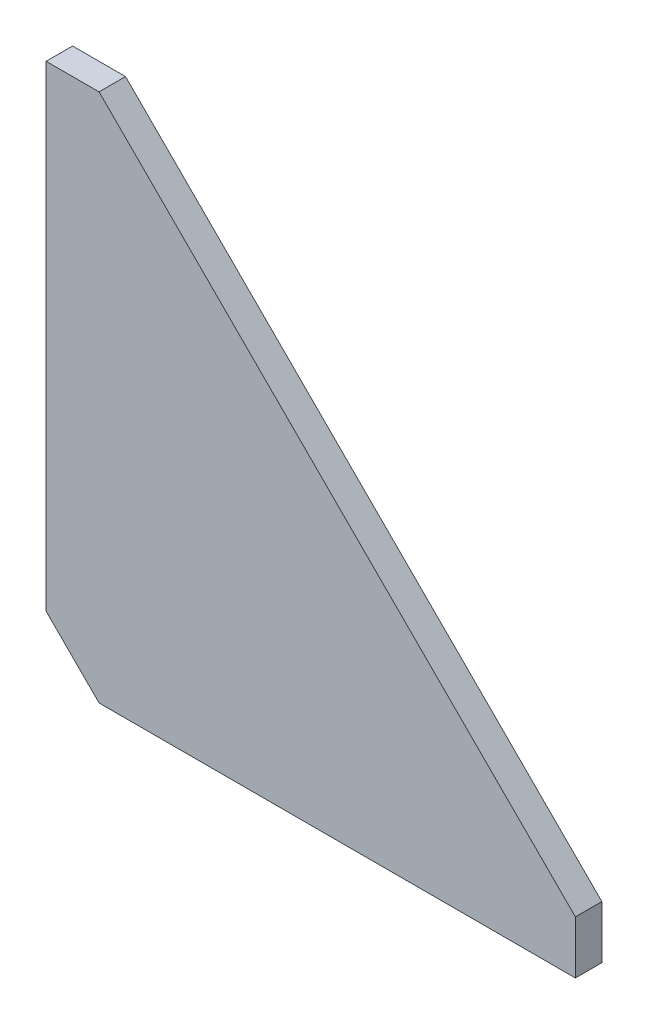
ISO-10303-21;
HEADER;
FILE_DESCRIPTION(('STEP AP214'),'2;1');
FILE_NAME('part.step','',(''),(''),'','','');
FILE_SCHEMA(('AUTOMOTIVE_DESIGN { 1 0 10303 214 1 1 1 1 }'));
ENDSEC;
DATA;
#1=APPLICATION_CONTEXT('core data for automotive mechanical design processes');
#2=APPLICATION_PROTOCOL_DEFINITION('international standard','automotive_design',2000,#1);
#3=PRODUCT_CONTEXT('',#1,'mechanical');
#4=PRODUCT('Part','Part','',(#3));
#5=PRODUCT_RELATED_PRODUCT_CATEGORY('part','',(#4));
#6=PRODUCT_DEFINITION_FORMATION('','',#4);
#7=PRODUCT_DEFINITION_CONTEXT('part definition',#1,'design');
#8=PRODUCT_DEFINITION('design','',#6,#7);
#9=PRODUCT_DEFINITION_SHAPE('','',#8);
#10=(LENGTH_UNIT() NAMED_UNIT(*) SI_UNIT(.MILLI.,.METRE.));
#11=(NAMED_UNIT(*) PLANE_ANGLE_UNIT() SI_UNIT($,.RADIAN.));
#12=(NAMED_UNIT(*) SI_UNIT($,.STERADIAN.) SOLID_ANGLE_UNIT());
#13=UNCERTAINTY_MEASURE_WITH_UNIT(LENGTH_MEASURE(1.E-05),#10,'distance_accuracy_value','');
#14=(GEOMETRIC_REPRESENTATION_CONTEXT(3) GLOBAL_UNCERTAINTY_ASSIGNED_CONTEXT((#13)) GLOBAL_UNIT_ASSIGNED_CONTEXT((#10,
#11,#12)) REPRESENTATION_CONTEXT('',''));
#15=CARTESIAN_POINT('',(0.,0.,0.));
#16=DIRECTION('',(0.,0.,1.));
#17=DIRECTION('',(1.,0.,0.));
#18=AXIS2_PLACEMENT_3D('',#15,#16,#17);
#19=CARTESIAN_POINT('',(100.,0.,2.5));
#20=DIRECTION('',(0.,1.,0.));
#21=DIRECTION('',(-1.,0.,0.));
#22=AXIS2_PLACEMENT_3D('',#19,#20,#21);
#23=PLANE('',#22);
#24=DIRECTION('',(1.,0.,0.));
#25=VECTOR('',#24,1.);
#26=CARTESIAN_POINT('',(100.,0.,2.5));
#27=LINE('',#26,#25);
#28=CARTESIAN_POINT('',(10.,0.,2.5));
#29=VERTEX_POINT('',#28);
#30=CARTESIAN_POINT('',(100.,0.,2.5));
#31=VERTEX_POINT('',#30);
#32=EDGE_CURVE('E101',#29,#31,#27,.T.);
#33=ORIENTED_EDGE('',*,*,#32,.F.);
#34=DIRECTION('',(0.,0.,-1.));
#35=VECTOR('',#34,1.);
#36=CARTESIAN_POINT('',(10.,0.,2.5));
#37=LINE('',#36,#35);
#38=CARTESIAN_POINT('',(10.,0.,-2.5));
#39=VERTEX_POINT('',#38);
#40=EDGE_CURVE('E127',#29,#39,#37,.T.);
#41=ORIENTED_EDGE('',*,*,#40,.T.);
#42=DIRECTION('',(1.,0.,0.));
#43=VECTOR('',#42,1.);
#44=CARTESIAN_POINT('',(100.,0.,-2.5));
#45=LINE('',#44,#43);
#46=CARTESIAN_POINT('',(100.,0.,-2.5));
#47=VERTEX_POINT('',#46);
#48=EDGE_CURVE('E124',#39,#47,#45,.T.);
#49=ORIENTED_EDGE('',*,*,#48,.T.);
#50=DIRECTION('',(0.,0.,-1.));
#51=VECTOR('',#50,1.);
#52=CARTESIAN_POINT('',(100.,0.,2.5));
#53=LINE('',#52,#51);
#54=EDGE_CURVE('E117',#31,#47,#53,.T.);
#55=ORIENTED_EDGE('',*,*,#54,.F.);
#56=EDGE_LOOP('',(#33,#41,#49,#55));
#57=FACE_BOUND('',#56,.T.);
#58=ADVANCED_FACE('F47',(#57),#23,.F.);
#59=CARTESIAN_POINT('',(100.,10.,2.5));
#60=DIRECTION('',(-1.,0.,0.));
#61=DIRECTION('',(0.,0.,1.));
#62=AXIS2_PLACEMENT_3D('',#59,#60,#61);
#63=PLANE('',#62);
#64=DIRECTION('',(0.,1.,0.));
#65=VECTOR('',#64,1.);
#66=CARTESIAN_POINT('',(100.,10.,-2.5));
#67=LINE('',#66,#65);
#68=CARTESIAN_POINT('',(100.,10.,-2.5));
#69=VERTEX_POINT('',#68);
#70=EDGE_CURVE('E159',#47,#69,#67,.T.);
#71=ORIENTED_EDGE('',*,*,#70,.T.);
#72=DIRECTION('',(0.,0.,-1.));
#73=VECTOR('',#72,1.);
#74=CARTESIAN_POINT('',(100.,10.,2.5));
#75=LINE('',#74,#73);
#76=CARTESIAN_POINT('',(100.,10.,2.5));
#77=VERTEX_POINT('',#76);
#78=EDGE_CURVE('E119',#77,#69,#75,.T.);
#79=ORIENTED_EDGE('',*,*,#78,.F.);
#80=DIRECTION('',(0.,1.,0.));
#81=VECTOR('',#80,1.);
#82=CARTESIAN_POINT('',(100.,10.,2.5));
#83=LINE('',#82,#81);
#84=EDGE_CURVE('E104',#31,#77,#83,.T.);
#85=ORIENTED_EDGE('',*,*,#84,.F.);
#86=ORIENTED_EDGE('',*,*,#54,.T.);
#87=EDGE_LOOP('',(#71,#79,#85,#86));
#88=FACE_BOUND('',#87,.T.);
#89=ADVANCED_FACE('F116',(#88),#63,.F.);
#90=CARTESIAN_POINT('',(10.,100.,2.5));
#91=DIRECTION('',(-0.707106781186548,-0.707106781186548,0.));
#92=DIRECTION('',(0.707106781186548,-0.707106781186548,0.));
#93=AXIS2_PLACEMENT_3D('',#90,#91,#92);
#94=PLANE('',#93);
#95=DIRECTION('',(-0.707106781186548,0.707106781186548,0.));
#96=VECTOR('',#95,1.);
#97=CARTESIAN_POINT('',(10.,100.,-2.5));
#98=LINE('',#97,#96);
#99=CARTESIAN_POINT('',(10.,100.,-2.5));
#100=VERTEX_POINT('',#99);
#101=EDGE_CURVE('E156',#69,#100,#98,.T.);
#102=ORIENTED_EDGE('',*,*,#101,.T.);
#103=DIRECTION('',(0.,0.,-1.));
#104=VECTOR('',#103,1.);
#105=CARTESIAN_POINT('',(10.,100.,2.5));
#106=LINE('',#105,#104);
#107=CARTESIAN_POINT('',(10.,100.,2.5));
#108=VERTEX_POINT('',#107);
#109=EDGE_CURVE('E133',#108,#100,#106,.T.);
#110=ORIENTED_EDGE('',*,*,#109,.F.);
#111=DIRECTION('',(-0.707106781186548,0.707106781186548,0.));
#112=VECTOR('',#111,1.);
#113=CARTESIAN_POINT('',(10.,100.,2.5));
#114=LINE('',#113,#112);
#115=EDGE_CURVE('E122',#77,#108,#114,.T.);
#116=ORIENTED_EDGE('',*,*,#115,.F.);
#117=ORIENTED_EDGE('',*,*,#78,.T.);
#118=EDGE_LOOP('',(#102,#110,#116,#117));
#119=FACE_BOUND('',#118,.T.);
#120=ADVANCED_FACE('F175',(#119),#94,.F.);
#121=CARTESIAN_POINT('',(0.,100.,2.5));
#122=DIRECTION('',(0.,-1.,0.));
#123=DIRECTION('',(0.,0.,-1.));
#124=AXIS2_PLACEMENT_3D('',#121,#122,#123);
#125=PLANE('',#124);
#126=DIRECTION('',(-1.,0.,0.));
#127=VECTOR('',#126,1.);
#128=CARTESIAN_POINT('',(0.,100.,-2.5));
#129=LINE('',#128,#127);
#130=CARTESIAN_POINT('',(0.,100.,-2.5));
#131=VERTEX_POINT('',#130);
#132=EDGE_CURVE('E153',#100,#131,#129,.T.);
#133=ORIENTED_EDGE('',*,*,#132,.T.);
#134=DIRECTION('',(0.,0.,-1.));
#135=VECTOR('',#134,1.);
#136=CARTESIAN_POINT('',(0.,100.,2.5));
#137=LINE('',#136,#135);
#138=CARTESIAN_POINT('',(0.,100.,2.5));
#139=VERTEX_POINT('',#138);
#140=EDGE_CURVE('E146',#139,#131,#137,.T.);
#141=ORIENTED_EDGE('',*,*,#140,.F.);
#142=DIRECTION('',(-1.,0.,0.));
#143=VECTOR('',#142,1.);
#144=CARTESIAN_POINT('',(0.,100.,2.5));
#145=LINE('',#144,#143);
#146=EDGE_CURVE('E166',#108,#139,#145,.T.);
#147=ORIENTED_EDGE('',*,*,#146,.F.);
#148=ORIENTED_EDGE('',*,*,#109,.T.);
#149=EDGE_LOOP('',(#133,#141,#147,#148));
#150=FACE_BOUND('',#149,.T.);
#151=ADVANCED_FACE('F179',(#150),#125,.F.);
#152=CARTESIAN_POINT('',(0.,0.,2.5));
#153=DIRECTION('',(1.,0.,0.));
#154=DIRECTION('',(0.,0.,-1.));
#155=AXIS2_PLACEMENT_3D('',#152,#153,#154);
#156=PLANE('',#155);
#157=DIRECTION('',(0.,-1.,0.));
#158=VECTOR('',#157,1.);
#159=CARTESIAN_POINT('',(0.,0.,-2.5));
#160=LINE('',#159,#158);
#161=CARTESIAN_POINT('',(0.,10.,-2.5));
#162=VERTEX_POINT('',#161);
#163=EDGE_CURVE('E112',#131,#162,#160,.T.);
#164=ORIENTED_EDGE('',*,*,#163,.T.);
#165=DIRECTION('',(0.,0.,1.));
#166=VECTOR('',#165,1.);
#167=CARTESIAN_POINT('',(0.,10.,2.5));
#168=LINE('',#167,#166);
#169=CARTESIAN_POINT('',(0.,10.,2.5));
#170=VERTEX_POINT('',#169);
#171=EDGE_CURVE('E57',#162,#170,#168,.T.);
#172=ORIENTED_EDGE('',*,*,#171,.T.);
#173=DIRECTION('',(0.,-1.,0.));
#174=VECTOR('',#173,1.);
#175=CARTESIAN_POINT('',(0.,0.,2.5));
#176=LINE('',#175,#174);
#177=EDGE_CURVE('E150',#139,#170,#176,.T.);
#178=ORIENTED_EDGE('',*,*,#177,.F.);
#179=ORIENTED_EDGE('',*,*,#140,.T.);
#180=EDGE_LOOP('',(#164,#172,#178,#179));
#181=FACE_BOUND('',#180,.T.);
#182=ADVANCED_FACE('F180',(#181),#156,.F.);
#183=CARTESIAN_POINT('',(0.,0.,2.5));
#184=DIRECTION('',(0.,0.,-1.));
#185=DIRECTION('',(-1.,0.,0.));
#186=AXIS2_PLACEMENT_3D('',#183,#184,#185);
#187=PLANE('',#186);
#188=ORIENTED_EDGE('',*,*,#177,.T.);
#189=DIRECTION('',(-0.707106781186546,0.707106781186549,0.));
#190=VECTOR('',#189,1.);
#191=CARTESIAN_POINT('',(10.,0.,2.5));
#192=LINE('',#191,#190);
#193=EDGE_CURVE('E11',#170,#29,#192,.F.);
#194=ORIENTED_EDGE('',*,*,#193,.T.);
#195=ORIENTED_EDGE('',*,*,#32,.T.);
#196=ORIENTED_EDGE('',*,*,#84,.T.);
#197=ORIENTED_EDGE('',*,*,#115,.T.);
#198=ORIENTED_EDGE('',*,*,#146,.T.);
#199=EDGE_LOOP('',(#188,#194,#195,#196,#197,#198));
#200=FACE_BOUND('',#199,.T.);
#201=ADVANCED_FACE('F103',(#200),#187,.F.);
#202=CARTESIAN_POINT('',(0.,0.,-2.5));
#203=DIRECTION('',(0.,0.,-1.));
#204=DIRECTION('',(-1.,0.,0.));
#205=AXIS2_PLACEMENT_3D('',#202,#203,#204);
#206=PLANE('',#205);
#207=ORIENTED_EDGE('',*,*,#48,.F.);
#208=DIRECTION('',(0.707106781186546,-0.707106781186549,0.));
#209=VECTOR('',#208,1.);
#210=CARTESIAN_POINT('',(5.00000000000002,5.,-2.5));
#211=LINE('',#210,#209);
#212=EDGE_CURVE('E71',#39,#162,#211,.F.);
#213=ORIENTED_EDGE('',*,*,#212,.T.);
#214=ORIENTED_EDGE('',*,*,#163,.F.);
#215=ORIENTED_EDGE('',*,*,#132,.F.);
#216=ORIENTED_EDGE('',*,*,#101,.F.);
#217=ORIENTED_EDGE('',*,*,#70,.F.);
#218=EDGE_LOOP('',(#207,#213,#214,#215,#216,#217));
#219=FACE_BOUND('',#218,.T.);
#220=ADVANCED_FACE('F182',(#219),#206,.T.);
#221=CARTESIAN_POINT('',(10.,0.,2.5));
#222=DIRECTION('',(0.707106781186549,0.707106781186546,0.));
#223=DIRECTION('',(0.,0.,-1.));
#224=AXIS2_PLACEMENT_3D('',#221,#222,#223);
#225=PLANE('',#224);
#226=ORIENTED_EDGE('',*,*,#193,.F.);
#227=ORIENTED_EDGE('',*,*,#171,.F.);
#228=ORIENTED_EDGE('',*,*,#212,.F.);
#229=ORIENTED_EDGE('',*,*,#40,.F.);
#230=EDGE_LOOP('',(#226,#227,#228,#229));
#231=FACE_BOUND('',#230,.T.);
#232=ADVANCED_FACE('F50',(#231),#225,.F.);
#233=CLOSED_SHELL('',(#58,#89,#120,#151,#182,#201,#220,#232));
#234=MANIFOLD_SOLID_BREP('B2',#233);
#235=ADVANCED_BREP_SHAPE_REPRESENTATION('',(#18,#234),#14);
#236=SHAPE_DEFINITION_REPRESENTATION(#9,#235);
ENDSEC;
END-ISO-10303-21;
